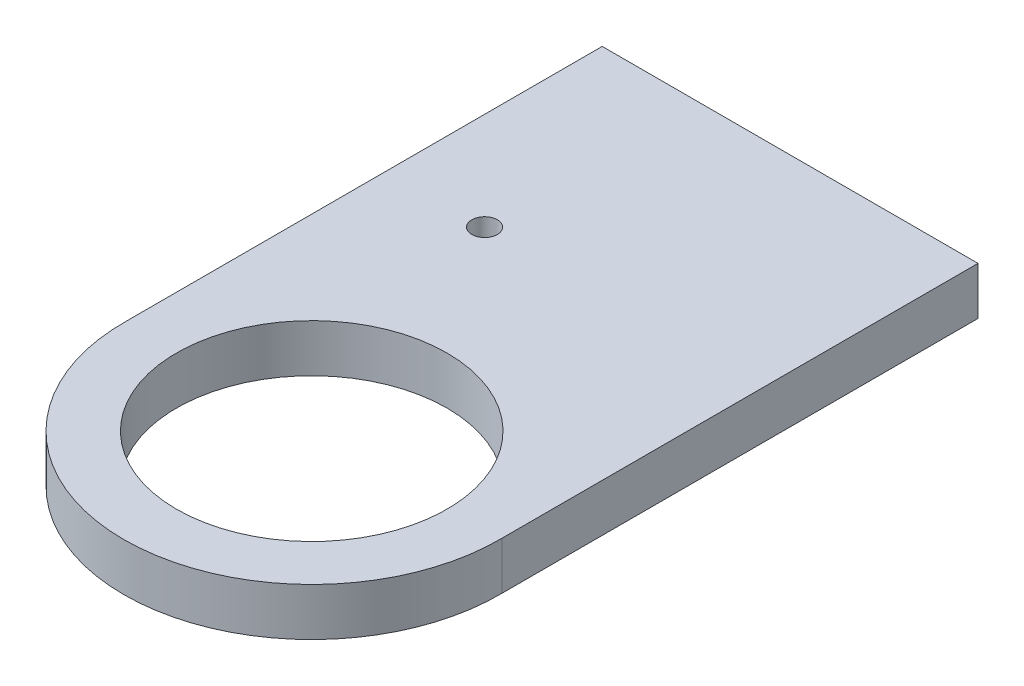
ISO-10303-21;
HEADER;
FILE_DESCRIPTION(('STEP AP214'),'2;1');
FILE_NAME('part.step','',(''),(''),'','','');
FILE_SCHEMA(('AUTOMOTIVE_DESIGN { 1 0 10303 214 1 1 1 1 }'));
ENDSEC;
DATA;
#1=APPLICATION_CONTEXT('core data for automotive mechanical design processes');
#2=APPLICATION_PROTOCOL_DEFINITION('international standard','automotive_design',2000,#1);
#3=PRODUCT_CONTEXT('',#1,'mechanical');
#4=PRODUCT('Part','Part','',(#3));
#5=PRODUCT_RELATED_PRODUCT_CATEGORY('part','',(#4));
#6=PRODUCT_DEFINITION_FORMATION('','',#4);
#7=PRODUCT_DEFINITION_CONTEXT('part definition',#1,'design');
#8=PRODUCT_DEFINITION('design','',#6,#7);
#9=PRODUCT_DEFINITION_SHAPE('','',#8);
#10=(LENGTH_UNIT() NAMED_UNIT(*) SI_UNIT(.MILLI.,.METRE.));
#11=(NAMED_UNIT(*) PLANE_ANGLE_UNIT() SI_UNIT($,.RADIAN.));
#12=(NAMED_UNIT(*) SI_UNIT($,.STERADIAN.) SOLID_ANGLE_UNIT());
#13=UNCERTAINTY_MEASURE_WITH_UNIT(LENGTH_MEASURE(1.E-05),#10,'distance_accuracy_value','');
#14=(GEOMETRIC_REPRESENTATION_CONTEXT(3) GLOBAL_UNCERTAINTY_ASSIGNED_CONTEXT((#13)) GLOBAL_UNIT_ASSIGNED_CONTEXT((#10,
#11,#12)) REPRESENTATION_CONTEXT('',''));
#15=CARTESIAN_POINT('',(0.,0.,0.));
#16=DIRECTION('',(0.,0.,1.));
#17=DIRECTION('',(1.,0.,0.));
#18=AXIS2_PLACEMENT_3D('',#15,#16,#17);
#19=CARTESIAN_POINT('',(-25.,27.85,489.65));
#20=DIRECTION('',(0.,0.,-1.));
#21=DIRECTION('',(-1.,0.,0.));
#22=AXIS2_PLACEMENT_3D('',#19,#20,#21);
#23=PLANE('',#22);
#24=DIRECTION('',(0.,-1.,0.));
#25=VECTOR('',#24,1.);
#26=CARTESIAN_POINT('',(24.9975498799382,27.85,489.65));
#27=LINE('',#26,#25);
#28=CARTESIAN_POINT('',(24.9975498799382,21.5,489.65));
#29=VERTEX_POINT('',#28);
#30=CARTESIAN_POINT('',(24.9975498799382,27.85,489.65));
#31=VERTEX_POINT('',#30);
#32=EDGE_CURVE('E107',#29,#31,#27,.F.);
#33=ORIENTED_EDGE('',*,*,#32,.F.);
#34=DIRECTION('',(1.,0.,0.));
#35=VECTOR('',#34,1.);
#36=CARTESIAN_POINT('',(-25.,21.5,489.65));
#37=LINE('',#36,#35);
#38=CARTESIAN_POINT('',(25.,21.5,489.65));
#39=VERTEX_POINT('',#38);
#40=EDGE_CURVE('E99',#29,#39,#37,.T.);
#41=ORIENTED_EDGE('',*,*,#40,.T.);
#42=DIRECTION('',(0.,-1.,0.));
#43=VECTOR('',#42,1.);
#44=CARTESIAN_POINT('',(25.,27.85,489.65));
#45=LINE('',#44,#43);
#46=CARTESIAN_POINT('',(25.,27.85,489.65));
#47=VERTEX_POINT('',#46);
#48=EDGE_CURVE('E135',#47,#39,#45,.T.);
#49=ORIENTED_EDGE('',*,*,#48,.F.);
#50=DIRECTION('',(1.,0.,0.));
#51=VECTOR('',#50,1.);
#52=CARTESIAN_POINT('',(-25.,27.85,489.65));
#53=LINE('',#52,#51);
#54=EDGE_CURVE('E53',#31,#47,#53,.T.);
#55=ORIENTED_EDGE('',*,*,#54,.F.);
#56=EDGE_LOOP('',(#33,#41,#49,#55));
#57=FACE_BOUND('',#56,.T.);
#58=ADVANCED_FACE('F39',(#57),#23,.F.);
#59=DIRECTION('',(0.,-1.,0.));
#60=VECTOR('',#59,1.);
#61=CARTESIAN_POINT('',(-24.9975498799382,27.85,489.65));
#62=LINE('',#61,#60);
#63=CARTESIAN_POINT('',(-24.9975498799382,27.85,489.65));
#64=VERTEX_POINT('',#63);
#65=CARTESIAN_POINT('',(-24.9975498799382,21.5,489.65));
#66=VERTEX_POINT('',#65);
#67=EDGE_CURVE('E65',#64,#66,#62,.T.);
#68=ORIENTED_EDGE('',*,*,#67,.F.);
#69=CARTESIAN_POINT('',(-25.,27.85,489.65));
#70=VERTEX_POINT('',#69);
#71=EDGE_CURVE('E129',#70,#64,#53,.T.);
#72=ORIENTED_EDGE('',*,*,#71,.F.);
#73=DIRECTION('',(0.,-1.,0.));
#74=VECTOR('',#73,1.);
#75=CARTESIAN_POINT('',(-25.,27.85,489.65));
#76=LINE('',#75,#74);
#77=CARTESIAN_POINT('',(-25.,21.5,489.65));
#78=VERTEX_POINT('',#77);
#79=EDGE_CURVE('E93',#70,#78,#76,.T.);
#80=ORIENTED_EDGE('',*,*,#79,.T.);
#81=EDGE_CURVE('E95',#78,#66,#37,.T.);
#82=ORIENTED_EDGE('',*,*,#81,.T.);
#83=EDGE_LOOP('',(#68,#72,#80,#82));
#84=FACE_BOUND('',#83,.T.);
#85=ADVANCED_FACE('F94',(#84),#23,.F.);
#86=CARTESIAN_POINT('',(25.,27.85,489.65));
#87=DIRECTION('',(-1.,0.,0.));
#88=DIRECTION('',(0.,0.,1.));
#89=AXIS2_PLACEMENT_3D('',#86,#87,#88);
#90=PLANE('',#89);
#91=DIRECTION('',(0.,0.,-1.));
#92=VECTOR('',#91,1.);
#93=CARTESIAN_POINT('',(25.,21.5,489.65));
#94=LINE('',#93,#92);
#95=CARTESIAN_POINT('',(25.,21.5,426.35));
#96=VERTEX_POINT('',#95);
#97=EDGE_CURVE('E124',#39,#96,#94,.T.);
#98=ORIENTED_EDGE('',*,*,#97,.T.);
#99=DIRECTION('',(0.,-1.,0.));
#100=VECTOR('',#99,1.);
#101=CARTESIAN_POINT('',(25.,27.85,426.35));
#102=LINE('',#101,#100);
#103=CARTESIAN_POINT('',(25.,27.85,426.35));
#104=VERTEX_POINT('',#103);
#105=EDGE_CURVE('E11',#104,#96,#102,.T.);
#106=ORIENTED_EDGE('',*,*,#105,.F.);
#107=DIRECTION('',(0.,0.,-1.));
#108=VECTOR('',#107,1.);
#109=CARTESIAN_POINT('',(25.,27.85,489.65));
#110=LINE('',#109,#108);
#111=EDGE_CURVE('E100',#47,#104,#110,.T.);
#112=ORIENTED_EDGE('',*,*,#111,.F.);
#113=ORIENTED_EDGE('',*,*,#48,.T.);
#114=EDGE_LOOP('',(#98,#106,#112,#113));
#115=FACE_BOUND('',#114,.T.);
#116=ADVANCED_FACE('F41',(#115),#90,.F.);
#117=CARTESIAN_POINT('',(-25.,27.85,426.35));
#118=DIRECTION('',(0.,0.,1.));
#119=DIRECTION('',(1.,0.,0.));
#120=AXIS2_PLACEMENT_3D('',#117,#118,#119);
#121=PLANE('',#120);
#122=CARTESIAN_POINT('',(-15.,24.675,426.35));
#123=DIRECTION('',(0.,0.,-1.));
#124=DIRECTION('',(-1.,0.,0.));
#125=AXIS2_PLACEMENT_3D('',#122,#123,#124);
#126=CIRCLE('',#125,1.25);
#127=CARTESIAN_POINT('',(-16.25,24.675,426.35));
#128=VERTEX_POINT('',#127);
#129=EDGE_CURVE('E185',#128,#128,#126,.T.);
#130=ORIENTED_EDGE('',*,*,#129,.F.);
#131=EDGE_LOOP('',(#130));
#132=FACE_BOUND('',#131,.T.);
#133=CARTESIAN_POINT('',(15.,24.675,426.35));
#134=DIRECTION('',(0.,0.,-1.));
#135=DIRECTION('',(-1.,0.,0.));
#136=AXIS2_PLACEMENT_3D('',#133,#134,#135);
#137=CIRCLE('',#136,1.25);
#138=CARTESIAN_POINT('',(13.75,24.675,426.35));
#139=VERTEX_POINT('',#138);
#140=EDGE_CURVE('E184',#139,#139,#137,.T.);
#141=ORIENTED_EDGE('',*,*,#140,.F.);
#142=EDGE_LOOP('',(#141));
#143=FACE_BOUND('',#142,.T.);
#144=DIRECTION('',(-1.,0.,0.));
#145=VECTOR('',#144,1.);
#146=CARTESIAN_POINT('',(-25.,21.5,426.35));
#147=LINE('',#146,#145);
#148=CARTESIAN_POINT('',(-25.,21.5,426.35));
#149=VERTEX_POINT('',#148);
#150=EDGE_CURVE('E134',#96,#149,#147,.T.);
#151=ORIENTED_EDGE('',*,*,#150,.T.);
#152=DIRECTION('',(0.,-1.,0.));
#153=VECTOR('',#152,1.);
#154=CARTESIAN_POINT('',(-25.,27.85,426.35));
#155=LINE('',#154,#153);
#156=CARTESIAN_POINT('',(-25.,27.85,426.35));
#157=VERTEX_POINT('',#156);
#158=EDGE_CURVE('E50',#157,#149,#155,.T.);
#159=ORIENTED_EDGE('',*,*,#158,.F.);
#160=DIRECTION('',(-1.,0.,0.));
#161=VECTOR('',#160,1.);
#162=CARTESIAN_POINT('',(-25.,27.85,426.35));
#163=LINE('',#162,#161);
#164=EDGE_CURVE('E126',#104,#157,#163,.T.);
#165=ORIENTED_EDGE('',*,*,#164,.F.);
#166=ORIENTED_EDGE('',*,*,#105,.T.);
#167=EDGE_LOOP('',(#151,#159,#165,#166));
#168=FACE_BOUND('',#167,.T.);
#169=ADVANCED_FACE('F147',(#132,#143,#168),#121,.F.);
#170=CARTESIAN_POINT('',(-25.,27.85,489.65));
#171=DIRECTION('',(1.,0.,0.));
#172=DIRECTION('',(0.,0.,-1.));
#173=AXIS2_PLACEMENT_3D('',#170,#171,#172);
#174=PLANE('',#173);
#175=DIRECTION('',(0.,0.,1.));
#176=VECTOR('',#175,1.);
#177=CARTESIAN_POINT('',(-25.,21.5,489.65));
#178=LINE('',#177,#176);
#179=EDGE_CURVE('E140',#149,#78,#178,.T.);
#180=ORIENTED_EDGE('',*,*,#179,.T.);
#181=ORIENTED_EDGE('',*,*,#79,.F.);
#182=DIRECTION('',(0.,0.,1.));
#183=VECTOR('',#182,1.);
#184=CARTESIAN_POINT('',(-25.,27.85,489.65));
#185=LINE('',#184,#183);
#186=EDGE_CURVE('E127',#157,#70,#185,.T.);
#187=ORIENTED_EDGE('',*,*,#186,.F.);
#188=ORIENTED_EDGE('',*,*,#158,.T.);
#189=EDGE_LOOP('',(#180,#181,#187,#188));
#190=FACE_BOUND('',#189,.T.);
#191=ADVANCED_FACE('F143',(#190),#174,.F.);
#192=CARTESIAN_POINT('',(0.,27.85,0.));
#193=DIRECTION('',(0.,-1.,0.));
#194=DIRECTION('',(0.,0.,-1.));
#195=AXIS2_PLACEMENT_3D('',#192,#193,#194);
#196=PLANE('',#195);
#197=CARTESIAN_POINT('',(-12.,27.85,455.));
#198=DIRECTION('',(0.,1.,0.));
#199=DIRECTION('',(0.,0.,1.));
#200=AXIS2_PLACEMENT_3D('',#197,#198,#199);
#201=CIRCLE('',#200,1.7);
#202=CARTESIAN_POINT('',(-12.,27.85,456.7));
#203=VERTEX_POINT('',#202);
#204=EDGE_CURVE('E194',#203,#203,#201,.T.);
#205=ORIENTED_EDGE('',*,*,#204,.F.);
#206=EDGE_LOOP('',(#205));
#207=FACE_BOUND('',#206,.T.);
#208=CARTESIAN_POINT('',(0.,27.85,490.));
#209=DIRECTION('',(0.,1.,0.));
#210=DIRECTION('',(0.,0.,1.));
#211=AXIS2_PLACEMENT_3D('',#208,#209,#210);
#212=CIRCLE('',#211,18.);
#213=CARTESIAN_POINT('',(0.,27.85,508.));
#214=VERTEX_POINT('',#213);
#215=EDGE_CURVE('E112',#214,#214,#212,.T.);
#216=ORIENTED_EDGE('',*,*,#215,.F.);
#217=EDGE_LOOP('',(#216));
#218=FACE_BOUND('',#217,.T.);
#219=ORIENTED_EDGE('',*,*,#71,.T.);
#220=CARTESIAN_POINT('',(0.,27.85,490.));
#221=DIRECTION('',(0.,1.,0.));
#222=DIRECTION('',(0.,0.,1.));
#223=AXIS2_PLACEMENT_3D('',#220,#221,#222);
#224=CIRCLE('',#223,25.);
#225=EDGE_CURVE('E108',#64,#31,#224,.T.);
#226=ORIENTED_EDGE('',*,*,#225,.T.);
#227=ORIENTED_EDGE('',*,*,#54,.T.);
#228=ORIENTED_EDGE('',*,*,#111,.T.);
#229=ORIENTED_EDGE('',*,*,#164,.T.);
#230=ORIENTED_EDGE('',*,*,#186,.T.);
#231=EDGE_LOOP('',(#219,#226,#227,#228,#229,#230));
#232=FACE_BOUND('',#231,.T.);
#233=ADVANCED_FACE('F155',(#207,#218,#232),#196,.F.);
#234=CARTESIAN_POINT('',(0.,21.5,0.));
#235=DIRECTION('',(0.,-1.,0.));
#236=DIRECTION('',(0.,0.,-1.));
#237=AXIS2_PLACEMENT_3D('',#234,#235,#236);
#238=PLANE('',#237);
#239=CARTESIAN_POINT('',(-12.,21.5,455.));
#240=DIRECTION('',(0.,1.,0.));
#241=DIRECTION('',(0.,0.,1.));
#242=AXIS2_PLACEMENT_3D('',#239,#240,#241);
#243=CIRCLE('',#242,1.7);
#244=CARTESIAN_POINT('',(-12.,21.5,456.7));
#245=VERTEX_POINT('',#244);
#246=EDGE_CURVE('E196',#245,#245,#243,.T.);
#247=ORIENTED_EDGE('',*,*,#246,.T.);
#248=EDGE_LOOP('',(#247));
#249=FACE_BOUND('',#248,.T.);
#250=CARTESIAN_POINT('',(0.,21.5,490.));
#251=DIRECTION('',(0.,1.,0.));
#252=DIRECTION('',(0.,0.,1.));
#253=AXIS2_PLACEMENT_3D('',#250,#251,#252);
#254=CIRCLE('',#253,18.);
#255=CARTESIAN_POINT('',(0.,21.5,508.));
#256=VERTEX_POINT('',#255);
#257=EDGE_CURVE('E117',#256,#256,#254,.T.);
#258=ORIENTED_EDGE('',*,*,#257,.T.);
#259=EDGE_LOOP('',(#258));
#260=FACE_BOUND('',#259,.T.);
#261=ORIENTED_EDGE('',*,*,#40,.F.);
#262=CARTESIAN_POINT('',(0.,21.5,490.));
#263=DIRECTION('',(0.,1.,0.));
#264=DIRECTION('',(0.,0.,1.));
#265=AXIS2_PLACEMENT_3D('',#262,#263,#264);
#266=CIRCLE('',#265,25.);
#267=EDGE_CURVE('E106',#66,#29,#266,.T.);
#268=ORIENTED_EDGE('',*,*,#267,.F.);
#269=ORIENTED_EDGE('',*,*,#81,.F.);
#270=ORIENTED_EDGE('',*,*,#179,.F.);
#271=ORIENTED_EDGE('',*,*,#150,.F.);
#272=ORIENTED_EDGE('',*,*,#97,.F.);
#273=EDGE_LOOP('',(#261,#268,#269,#270,#271,#272));
#274=FACE_BOUND('',#273,.T.);
#275=ADVANCED_FACE('F115',(#249,#260,#274),#238,.T.);
#276=CARTESIAN_POINT('',(0.,27.85,490.));
#277=DIRECTION('',(0.,-1.,0.));
#278=DIRECTION('',(0.,0.,-1.));
#279=AXIS2_PLACEMENT_3D('',#276,#277,#278);
#280=CYLINDRICAL_SURFACE('',#279,25.);
#281=ORIENTED_EDGE('',*,*,#267,.T.);
#282=ORIENTED_EDGE('',*,*,#32,.T.);
#283=ORIENTED_EDGE('',*,*,#225,.F.);
#284=ORIENTED_EDGE('',*,*,#67,.T.);
#285=EDGE_LOOP('',(#281,#282,#283,#284));
#286=FACE_BOUND('',#285,.T.);
#287=ADVANCED_FACE('F102',(#286),#280,.T.);
#288=CARTESIAN_POINT('',(0.,27.85,490.));
#289=DIRECTION('',(0.,-1.,0.));
#290=DIRECTION('',(0.,0.,-1.));
#291=AXIS2_PLACEMENT_3D('',#288,#289,#290);
#292=CYLINDRICAL_SURFACE('',#291,18.);
#293=ORIENTED_EDGE('',*,*,#215,.T.);
#294=EDGE_LOOP('',(#293));
#295=FACE_BOUND('',#294,.T.);
#296=ORIENTED_EDGE('',*,*,#257,.F.);
#297=EDGE_LOOP('',(#296));
#298=FACE_BOUND('',#297,.T.);
#299=ADVANCED_FACE('F201',(#295,#298),#292,.F.);
#300=CARTESIAN_POINT('',(-12.,27.85,455.));
#301=DIRECTION('',(0.,-1.,0.));
#302=DIRECTION('',(0.,0.,-1.));
#303=AXIS2_PLACEMENT_3D('',#300,#301,#302);
#304=CYLINDRICAL_SURFACE('',#303,1.7);
#305=ORIENTED_EDGE('',*,*,#204,.T.);
#306=EDGE_LOOP('',(#305));
#307=FACE_BOUND('',#306,.T.);
#308=ORIENTED_EDGE('',*,*,#246,.F.);
#309=EDGE_LOOP('',(#308));
#310=FACE_BOUND('',#309,.T.);
#311=ADVANCED_FACE('F203',(#307,#310),#304,.F.);
#312=CARTESIAN_POINT('',(15.,24.675,435.35));
#313=DIRECTION('',(0.,0.,-1.));
#314=DIRECTION('',(-1.,0.,0.));
#315=AXIS2_PLACEMENT_3D('',#312,#313,#314);
#316=CYLINDRICAL_SURFACE('',#315,1.25);
#317=CARTESIAN_POINT('',(15.,24.675,435.35));
#318=DIRECTION('',(0.,0.,-1.));
#319=DIRECTION('',(-1.,0.,0.));
#320=AXIS2_PLACEMENT_3D('',#317,#318,#319);
#321=CIRCLE('',#320,1.25);
#322=CARTESIAN_POINT('',(13.75,24.675,435.35));
#323=VERTEX_POINT('',#322);
#324=EDGE_CURVE('E190',#323,#323,#321,.T.);
#325=ORIENTED_EDGE('',*,*,#324,.F.);
#326=EDGE_LOOP('',(#325));
#327=FACE_BOUND('',#326,.T.);
#328=ORIENTED_EDGE('',*,*,#140,.T.);
#329=EDGE_LOOP('',(#328));
#330=FACE_BOUND('',#329,.T.);
#331=ADVANCED_FACE('F211',(#327,#330),#316,.F.);
#332=CARTESIAN_POINT('',(15.,24.675,435.35));
#333=DIRECTION('',(0.,0.,-1.));
#334=DIRECTION('',(-1.,0.,0.));
#335=AXIS2_PLACEMENT_3D('',#332,#333,#334);
#336=PLANE('',#335);
#337=ORIENTED_EDGE('',*,*,#324,.T.);
#338=EDGE_LOOP('',(#337));
#339=FACE_BOUND('',#338,.T.);
#340=ADVANCED_FACE('F214',(#339),#336,.T.);
#341=CARTESIAN_POINT('',(-15.,24.675,435.35));
#342=DIRECTION('',(0.,0.,-1.));
#343=DIRECTION('',(-1.,0.,0.));
#344=AXIS2_PLACEMENT_3D('',#341,#342,#343);
#345=CYLINDRICAL_SURFACE('',#344,1.25);
#346=CARTESIAN_POINT('',(-15.,24.675,435.35));
#347=DIRECTION('',(0.,0.,-1.));
#348=DIRECTION('',(-1.,0.,0.));
#349=AXIS2_PLACEMENT_3D('',#346,#347,#348);
#350=CIRCLE('',#349,1.25);
#351=CARTESIAN_POINT('',(-16.25,24.675,435.35));
#352=VERTEX_POINT('',#351);
#353=EDGE_CURVE('E186',#352,#352,#350,.T.);
#354=ORIENTED_EDGE('',*,*,#353,.F.);
#355=EDGE_LOOP('',(#354));
#356=FACE_BOUND('',#355,.T.);
#357=ORIENTED_EDGE('',*,*,#129,.T.);
#358=EDGE_LOOP('',(#357));
#359=FACE_BOUND('',#358,.T.);
#360=ADVANCED_FACE('F216',(#356,#359),#345,.F.);
#361=CARTESIAN_POINT('',(-15.,24.675,435.35));
#362=DIRECTION('',(0.,0.,-1.));
#363=DIRECTION('',(-1.,0.,0.));
#364=AXIS2_PLACEMENT_3D('',#361,#362,#363);
#365=PLANE('',#364);
#366=ORIENTED_EDGE('',*,*,#353,.T.);
#367=EDGE_LOOP('',(#366));
#368=FACE_BOUND('',#367,.T.);
#369=ADVANCED_FACE('F221',(#368),#365,.T.);
#370=CLOSED_SHELL('',(#58,#85,#116,#169,#191,#233,#275,#287,#299,#311,#331,#340,#360,#369));
#371=MANIFOLD_SOLID_BREP('B2',#370);
#372=ADVANCED_BREP_SHAPE_REPRESENTATION('',(#18,#371),#14);
#373=SHAPE_DEFINITION_REPRESENTATION(#9,#372);
ENDSEC;
END-ISO-10303-21;
